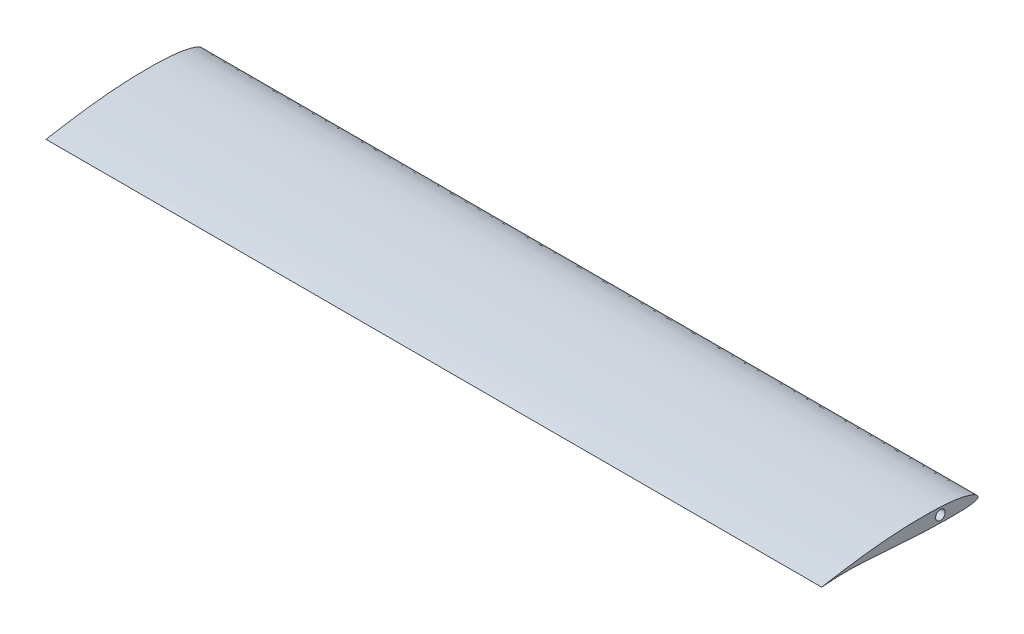
ISO-10303-21;
HEADER;
FILE_DESCRIPTION(('STEP AP214'),'2;1');
FILE_NAME('part.step','',(''),(''),'','','');
FILE_SCHEMA(('AUTOMOTIVE_DESIGN { 1 0 10303 214 1 1 1 1 }'));
ENDSEC;
DATA;
#1=APPLICATION_CONTEXT('core data for automotive mechanical design processes');
#2=APPLICATION_PROTOCOL_DEFINITION('international standard','automotive_design',2000,#1);
#3=PRODUCT_CONTEXT('',#1,'mechanical');
#4=PRODUCT('Part','Part','',(#3));
#5=PRODUCT_RELATED_PRODUCT_CATEGORY('part','',(#4));
#6=PRODUCT_DEFINITION_FORMATION('','',#4);
#7=PRODUCT_DEFINITION_CONTEXT('part definition',#1,'design');
#8=PRODUCT_DEFINITION('design','',#6,#7);
#9=PRODUCT_DEFINITION_SHAPE('','',#8);
#10=(LENGTH_UNIT() NAMED_UNIT(*) SI_UNIT(.MILLI.,.METRE.));
#11=(NAMED_UNIT(*) PLANE_ANGLE_UNIT() SI_UNIT($,.RADIAN.));
#12=(NAMED_UNIT(*) SI_UNIT($,.STERADIAN.) SOLID_ANGLE_UNIT());
#13=UNCERTAINTY_MEASURE_WITH_UNIT(LENGTH_MEASURE(1.E-05),#10,'distance_accuracy_value','');
#14=(GEOMETRIC_REPRESENTATION_CONTEXT(3) GLOBAL_UNCERTAINTY_ASSIGNED_CONTEXT((#13)) GLOBAL_UNIT_ASSIGNED_CONTEXT((#10,
#11,#12)) REPRESENTATION_CONTEXT('',''));
#15=CARTESIAN_POINT('',(0.,0.,0.));
#16=DIRECTION('',(0.,0.,1.));
#17=DIRECTION('',(1.,0.,0.));
#18=AXIS2_PLACEMENT_3D('',#15,#16,#17);
#19=CARTESIAN_POINT('',(1290.,0.,260.));
#20=CARTESIAN_POINT('',(1290.,-0.00836450781084765,260.000237425426));
#21=CARTESIAN_POINT('',(1290.,0.17927068428612,258.216353736153));
#22=CARTESIAN_POINT('',(1290.,0.321037615387213,256.378836916163));
#23=CARTESIAN_POINT('',(1290.,0.71312133760644,251.876962837134));
#24=CARTESIAN_POINT('',(1290.,1.11706559007267,246.278719714036));
#25=CARTESIAN_POINT('',(1290.,1.55720992954802,238.867601389705));
#26=CARTESIAN_POINT('',(1290.,1.89614734678387,230.031525046212));
#27=CARTESIAN_POINT('',(1290.,2.04633114470787,219.791122936035));
#28=CARTESIAN_POINT('',(1290.,1.90654989863903,208.386036068194));
#29=CARTESIAN_POINT('',(1290.,1.44518950143531,196.039910167381));
#30=CARTESIAN_POINT('',(1290.,0.734254641120929,182.99183491413));
#31=CARTESIAN_POINT('',(1290.,-0.166616987223974,169.448681914373));
#32=CARTESIAN_POINT('',(1290.,-1.19393698033351,155.600402613362));
#33=CARTESIAN_POINT('',(1290.,-2.27856190623283,141.623409194513));
#34=CARTESIAN_POINT('',(1290.,-3.34836733833728,127.677826169947));
#35=CARTESIAN_POINT('',(1290.,-4.31885285177987,113.900855730954));
#36=CARTESIAN_POINT('',(1290.,-5.13610693946993,100.407939813525));
#37=CARTESIAN_POINT('',(1290.,-5.75830393079422,87.2984520737085));
#38=CARTESIAN_POINT('',(1290.,-6.18555413279553,74.6739128622775));
#39=CARTESIAN_POINT('',(1290.,-6.46718897633444,62.6550662431943));
#40=CARTESIAN_POINT('',(1290.,-6.60958454607332,51.374682206385));
#41=CARTESIAN_POINT('',(1290.,-6.6366434813306,40.973115242036));
#42=CARTESIAN_POINT('',(1290.,-6.51565119953605,31.5764122356455));
#43=CARTESIAN_POINT('',(1290.,-6.25265151356062,23.308668347285));
#44=CARTESIAN_POINT('',(1290.,-5.82133125675498,16.2512763198776));
#45=CARTESIAN_POINT('',(1290.,-5.12585484253031,10.4747838113411));
#46=CARTESIAN_POINT('',(1290.,-4.20206486072263,5.92560031663002));
#47=CARTESIAN_POINT('',(1290.,-2.98038310378311,2.73033346429447));
#48=CARTESIAN_POINT('',(1290.,-1.77998960875286,0.514679594047473));
#49=CARTESIAN_POINT('',(1290.,-0.426872399851405,-0.0221650510671245));
#50=CARTESIAN_POINT('',(1290.,0.824366219771982,0.0324159675684111));
#51=CARTESIAN_POINT('',(1290.,2.39791171040937,0.845103211568665));
#52=CARTESIAN_POINT('',(1290.,4.40788652145266,2.8380180574038));
#53=CARTESIAN_POINT('',(1290.,6.36289900591226,6.00070353090517));
#54=CARTESIAN_POINT('',(1290.,8.23013796977206,10.2761805163656));
#55=CARTESIAN_POINT('',(1290.,10.0269709055182,15.6779276864178));
#56=CARTESIAN_POINT('',(1290.,11.735252347318,22.1507023104819));
#57=CARTESIAN_POINT('',(1290.,13.2999170289244,29.6370590050754));
#58=CARTESIAN_POINT('',(1290.,14.6617483044526,38.0716683424978));
#59=CARTESIAN_POINT('',(1290.,15.7658061778503,47.3959495779152));
#60=CARTESIAN_POINT('',(1290.,16.5993401578943,57.5462264774489));
#61=CARTESIAN_POINT('',(1290.,17.1538325279237,68.4491979583226));
#62=CARTESIAN_POINT('',(1290.,17.4636692933479,80.0086313108734));
#63=CARTESIAN_POINT('',(1290.,17.5393442961453,92.1096269892387));
#64=CARTESIAN_POINT('',(1290.,17.3957839030931,104.620879880964));
#65=CARTESIAN_POINT('',(1290.,17.0387204662747,117.404379021721));
#66=CARTESIAN_POINT('',(1290.,16.4585966132921,130.324080451916));
#67=CARTESIAN_POINT('',(1290.,15.6544251448711,143.253542740959));
#68=CARTESIAN_POINT('',(1290.,14.621712637195,156.075279757368));
#69=CARTESIAN_POINT('',(1290.,13.3968504654704,168.67903005791));
#70=CARTESIAN_POINT('',(1290.,12.0112515599174,180.948637295136));
#71=CARTESIAN_POINT('',(1290.,10.5208997181946,192.766459024276));
#72=CARTESIAN_POINT('',(1290.,8.97767429024449,204.009604965614));
#73=CARTESIAN_POINT('',(1290.,7.41677443920436,214.552459058349));
#74=CARTESIAN_POINT('',(1290.,5.96047063877256,224.182764610495));
#75=CARTESIAN_POINT('',(1290.,4.46502693224894,232.936243324283));
#76=CARTESIAN_POINT('',(1290.,3.30908122867847,240.617949869852));
#77=CARTESIAN_POINT('',(1290.,2.18290011399085,247.256298540505));
#78=CARTESIAN_POINT('',(1290.,1.29569639332671,252.326952140495));
#79=CARTESIAN_POINT('',(1290.,0.57497954408,256.510310505769));
#80=CARTESIAN_POINT('',(1290.,0.256065435225637,258.261534377982));
#81=CARTESIAN_POINT('',(1290.,0.00829647233421661,259.999764505752));
#82=CARTESIAN_POINT('',(1290.,0.,260.));
#83=B_SPLINE_CURVE_WITH_KNOTS('',3,(#19,#20,#21,#22,#23,#24,#25,#26,#27,#28,#29,#30,#31,#32,#33,
#34,#35,#36,#37,#38,#39,#40,#41,#42,#43,#44,#45,#46,#47,#48,#49,#50,#51,#52,#53,#54,#55,#56,#57,
#58,#59,#60,#61,#62,#63,#64,#65,#66,#67,#68,#69,#70,#71,#72,#73,#74,#75,#76,#77,#78,#79,#80,#81,
#82),.UNSPECIFIED.,.T.,.F.,(4,1,1,1,1,1,1,1,1,1,1,1,1,1,1,1,1,1,1,1,1,1,1,1,1,1,1,1,1,1,1,1,1,1,
1,1,1,1,1,1,1,1,1,1,1,1,1,1,1,1,1,1,1,1,1,1,1,1,1,1,1,4),(0.,0.00158888881614505,
0.00632921783555651,0.0142024564897437,0.0251728077530559,0.0391734833267745,0.0560606311759251,
0.0755789238487885,0.0973636066296907,0.120926258366677,0.145825281006277,0.171670911815127,
0.198108536705041,0.22479018357162,0.25139057978404,0.277643490654312,0.303326750051389,
0.328257458029316,0.352272548115194,0.375156061746876,0.396620664402003,0.416422729294005,
0.434304420097656,0.450054679859309,0.463465465082325,0.474478994238096,0.483169222153172,
0.489678354497499,0.494104066315723,0.496910015324886,0.497289784891853,0.501214273282497,
0.506457950332762,0.51335695674223,0.522168631834455,0.53296596992453,0.545689209241574,
0.56022077890382,0.57643892310517,0.594258689005965,0.613600244568652,0.634342385932902,
0.656331109263005,0.679351893859712,0.703152302846811,0.727478208080039,0.752070739407901,
0.776691163534608,0.801140183976245,0.825214386971546,0.848697423570622,0.871352857669295,
0.892947448931157,0.913230871058069,0.931955467148994,0.94834206907442,0.963693004275676,
0.976235918239566,0.986320058750392,0.993788799349345,0.998424034933867,1.),.UNSPECIFIED.);
#84=DIRECTION('',(-1.,0.,0.));
#85=VECTOR('',#84,1.);
#86=SURFACE_OF_LINEAR_EXTRUSION('',#83,#85);
#87=CARTESIAN_POINT('',(1290.,0.,260.));
#88=VERTEX_POINT('',#87);
#89=EDGE_CURVE('E10',#88,#88,#83,.T.);
#90=ORIENTED_EDGE('',*,*,#89,.F.);
#91=EDGE_LOOP('',(#90));
#92=FACE_BOUND('',#91,.T.);
#93=CARTESIAN_POINT('',(0.,0.,260.));
#94=CARTESIAN_POINT('',(0.,-0.00836450781084765,260.000237425426));
#95=CARTESIAN_POINT('',(0.,0.17927068428612,258.216353736153));
#96=CARTESIAN_POINT('',(0.,0.321037615387213,256.378836916163));
#97=CARTESIAN_POINT('',(0.,0.71312133760644,251.876962837134));
#98=CARTESIAN_POINT('',(0.,1.11706559007267,246.278719714036));
#99=CARTESIAN_POINT('',(0.,1.55720992954802,238.867601389705));
#100=CARTESIAN_POINT('',(0.,1.89614734678387,230.031525046212));
#101=CARTESIAN_POINT('',(0.,2.04633114470787,219.791122936035));
#102=CARTESIAN_POINT('',(0.,1.90654989863903,208.386036068194));
#103=CARTESIAN_POINT('',(0.,1.44518950143531,196.039910167381));
#104=CARTESIAN_POINT('',(0.,0.734254641120929,182.99183491413));
#105=CARTESIAN_POINT('',(0.,-0.166616987223974,169.448681914373));
#106=CARTESIAN_POINT('',(0.,-1.19393698033351,155.600402613362));
#107=CARTESIAN_POINT('',(0.,-2.27856190623283,141.623409194513));
#108=CARTESIAN_POINT('',(0.,-3.34836733833728,127.677826169947));
#109=CARTESIAN_POINT('',(0.,-4.31885285177987,113.900855730954));
#110=CARTESIAN_POINT('',(0.,-5.13610693946993,100.407939813525));
#111=CARTESIAN_POINT('',(0.,-5.75830393079422,87.2984520737085));
#112=CARTESIAN_POINT('',(0.,-6.18555413279553,74.6739128622775));
#113=CARTESIAN_POINT('',(0.,-6.46718897633444,62.6550662431943));
#114=CARTESIAN_POINT('',(0.,-6.60958454607332,51.374682206385));
#115=CARTESIAN_POINT('',(0.,-6.6366434813306,40.973115242036));
#116=CARTESIAN_POINT('',(0.,-6.51565119953605,31.5764122356455));
#117=CARTESIAN_POINT('',(0.,-6.25265151356062,23.308668347285));
#118=CARTESIAN_POINT('',(0.,-5.82133125675498,16.2512763198776));
#119=CARTESIAN_POINT('',(0.,-5.12585484253031,10.4747838113411));
#120=CARTESIAN_POINT('',(0.,-4.20206486072263,5.92560031663002));
#121=CARTESIAN_POINT('',(0.,-2.98038310378311,2.73033346429447));
#122=CARTESIAN_POINT('',(0.,-1.77998960875286,0.514679594047473));
#123=CARTESIAN_POINT('',(0.,-0.426872399851405,-0.0221650510671245));
#124=CARTESIAN_POINT('',(0.,0.824366219771982,0.0324159675684111));
#125=CARTESIAN_POINT('',(0.,2.39791171040937,0.845103211568665));
#126=CARTESIAN_POINT('',(0.,4.40788652145266,2.8380180574038));
#127=CARTESIAN_POINT('',(0.,6.36289900591226,6.00070353090517));
#128=CARTESIAN_POINT('',(0.,8.23013796977206,10.2761805163656));
#129=CARTESIAN_POINT('',(0.,10.0269709055182,15.6779276864178));
#130=CARTESIAN_POINT('',(0.,11.735252347318,22.1507023104819));
#131=CARTESIAN_POINT('',(0.,13.2999170289244,29.6370590050754));
#132=CARTESIAN_POINT('',(0.,14.6617483044526,38.0716683424978));
#133=CARTESIAN_POINT('',(0.,15.7658061778503,47.3959495779152));
#134=CARTESIAN_POINT('',(0.,16.5993401578943,57.5462264774489));
#135=CARTESIAN_POINT('',(0.,17.1538325279237,68.4491979583226));
#136=CARTESIAN_POINT('',(0.,17.4636692933479,80.0086313108734));
#137=CARTESIAN_POINT('',(0.,17.5393442961453,92.1096269892387));
#138=CARTESIAN_POINT('',(0.,17.3957839030931,104.620879880964));
#139=CARTESIAN_POINT('',(0.,17.0387204662747,117.404379021721));
#140=CARTESIAN_POINT('',(0.,16.4585966132921,130.324080451916));
#141=CARTESIAN_POINT('',(0.,15.6544251448711,143.253542740959));
#142=CARTESIAN_POINT('',(0.,14.621712637195,156.075279757368));
#143=CARTESIAN_POINT('',(0.,13.3968504654704,168.67903005791));
#144=CARTESIAN_POINT('',(0.,12.0112515599174,180.948637295136));
#145=CARTESIAN_POINT('',(0.,10.5208997181946,192.766459024276));
#146=CARTESIAN_POINT('',(0.,8.97767429024449,204.009604965614));
#147=CARTESIAN_POINT('',(0.,7.41677443920436,214.552459058349));
#148=CARTESIAN_POINT('',(0.,5.96047063877256,224.182764610495));
#149=CARTESIAN_POINT('',(0.,4.46502693224894,232.936243324283));
#150=CARTESIAN_POINT('',(0.,3.30908122867847,240.617949869852));
#151=CARTESIAN_POINT('',(0.,2.18290011399085,247.256298540505));
#152=CARTESIAN_POINT('',(0.,1.29569639332671,252.326952140495));
#153=CARTESIAN_POINT('',(0.,0.57497954408,256.510310505769));
#154=CARTESIAN_POINT('',(0.,0.256065435225637,258.261534377982));
#155=CARTESIAN_POINT('',(0.,0.00829647233421661,259.999764505752));
#156=CARTESIAN_POINT('',(0.,0.,260.));
#157=B_SPLINE_CURVE_WITH_KNOTS('',3,(#93,#94,#95,#96,#97,#98,#99,#100,#101,#102,#103,#104,#105,
#106,#107,#108,#109,#110,#111,#112,#113,#114,#115,#116,#117,#118,#119,#120,#121,#122,#123,#124,
#125,#126,#127,#128,#129,#130,#131,#132,#133,#134,#135,#136,#137,#138,#139,#140,#141,#142,#143,
#144,#145,#146,#147,#148,#149,#150,#151,#152,#153,#154,#155,#156),.UNSPECIFIED.,.T.,.F.,(4,1,1,
1,1,1,1,1,1,1,1,1,1,1,1,1,1,1,1,1,1,1,1,1,1,1,1,1,1,1,1,1,1,1,1,1,1,1,1,1,1,1,1,1,1,1,1,1,1,1,1,
1,1,1,1,1,1,1,1,1,1,4),(0.,0.00158888881614505,0.00632921783555651,0.0142024564897437,
0.0251728077530559,0.0391734833267745,0.0560606311759251,0.0755789238487885,0.0973636066296907,
0.120926258366677,0.145825281006277,0.171670911815127,0.198108536705041,0.22479018357162,
0.25139057978404,0.277643490654312,0.303326750051389,0.328257458029316,0.352272548115194,
0.375156061746876,0.396620664402003,0.416422729294005,0.434304420097656,0.450054679859309,
0.463465465082325,0.474478994238096,0.483169222153172,0.489678354497499,0.494104066315723,
0.496910015324886,0.497289784891853,0.501214273282497,0.506457950332762,0.51335695674223,
0.522168631834455,0.53296596992453,0.545689209241574,0.56022077890382,0.57643892310517,
0.594258689005965,0.613600244568652,0.634342385932902,0.656331109263005,0.679351893859712,
0.703152302846811,0.727478208080039,0.752070739407901,0.776691163534608,0.801140183976245,
0.825214386971546,0.848697423570622,0.871352857669295,0.892947448931157,0.913230871058069,
0.931955467148994,0.94834206907442,0.963693004275676,0.976235918239566,0.986320058750392,
0.993788799349345,0.998424034933867,1.),.UNSPECIFIED.);
#158=CARTESIAN_POINT('',(0.,0.,260.));
#159=VERTEX_POINT('',#158);
#160=EDGE_CURVE('E41',#159,#159,#157,.T.);
#161=ORIENTED_EDGE('',*,*,#160,.T.);
#162=EDGE_LOOP('',(#161));
#163=FACE_BOUND('',#162,.T.);
#164=ADVANCED_FACE('F37',(#92,#163),#86,.F.);
#165=CARTESIAN_POINT('',(1290.,1.55699578084547,0.452495766740479));
#166=DIRECTION('',(-1.,0.,0.));
#167=DIRECTION('',(0.,0.,1.));
#168=AXIS2_PLACEMENT_3D('',#165,#166,#167);
#169=PLANE('',#168);
#170=CARTESIAN_POINT('',(1290.,5.19465477293851,62.4999999999997));
#171=DIRECTION('',(1.,0.,0.));
#172=DIRECTION('',(0.,0.,-1.));
#173=AXIS2_PLACEMENT_3D('',#170,#171,#172);
#174=CIRCLE('',#173,8.);
#175=CARTESIAN_POINT('',(1290.,5.19465477293851,54.4999999999997));
#176=VERTEX_POINT('',#175);
#177=EDGE_CURVE('E56',#176,#176,#174,.T.);
#178=ORIENTED_EDGE('',*,*,#177,.F.);
#179=EDGE_LOOP('',(#178));
#180=FACE_BOUND('',#179,.T.);
#181=ORIENTED_EDGE('',*,*,#89,.T.);
#182=EDGE_LOOP('',(#181));
#183=FACE_BOUND('',#182,.T.);
#184=ADVANCED_FACE('F76',(#180,#183),#169,.F.);
#185=CARTESIAN_POINT('',(0.,1.55699578084547,0.452495766740479));
#186=DIRECTION('',(-1.,0.,0.));
#187=DIRECTION('',(0.,0.,1.));
#188=AXIS2_PLACEMENT_3D('',#185,#186,#187);
#189=PLANE('',#188);
#190=CARTESIAN_POINT('',(0.,5.19465477293851,62.4999999999997));
#191=DIRECTION('',(1.,0.,0.));
#192=DIRECTION('',(0.,0.,-1.));
#193=AXIS2_PLACEMENT_3D('',#190,#191,#192);
#194=CIRCLE('',#193,8.);
#195=CARTESIAN_POINT('',(0.,5.19465477293851,54.4999999999997));
#196=VERTEX_POINT('',#195);
#197=EDGE_CURVE('E51',#196,#196,#194,.T.);
#198=ORIENTED_EDGE('',*,*,#197,.T.);
#199=EDGE_LOOP('',(#198));
#200=FACE_BOUND('',#199,.T.);
#201=ORIENTED_EDGE('',*,*,#160,.F.);
#202=EDGE_LOOP('',(#201));
#203=FACE_BOUND('',#202,.T.);
#204=ADVANCED_FACE('F67',(#200,#203),#189,.T.);
#205=CARTESIAN_POINT('',(0.,5.19465477293851,62.4999999999997));
#206=DIRECTION('',(1.,0.,0.));
#207=DIRECTION('',(0.,0.,-1.));
#208=AXIS2_PLACEMENT_3D('',#205,#206,#207);
#209=CYLINDRICAL_SURFACE('',#208,8.);
#210=CARTESIAN_POINT('',(0.,5.19465477293851,54.4999999999997));
#211=CARTESIAN_POINT('',(13.4375,5.19465477293851,54.4999999999997));
#212=CARTESIAN_POINT('',(26.875,5.19465477293851,54.4999999999997));
#213=CARTESIAN_POINT('',(53.75,5.19465477293851,54.4999999999997));
#214=CARTESIAN_POINT('',(67.1875,5.19465477293851,54.4999999999997));
#215=CARTESIAN_POINT('',(94.0625,5.19465477293851,54.4999999999997));
#216=CARTESIAN_POINT('',(107.5,5.19465477293851,54.4999999999997));
#217=CARTESIAN_POINT('',(134.375,5.19465477293851,54.4999999999997));
#218=CARTESIAN_POINT('',(147.8125,5.19465477293851,54.4999999999997));
#219=CARTESIAN_POINT('',(174.6875,5.19465477293851,54.4999999999997));
#220=CARTESIAN_POINT('',(188.125,5.19465477293851,54.4999999999997));
#221=CARTESIAN_POINT('',(215.,5.19465477293851,54.4999999999997));
#222=CARTESIAN_POINT('',(228.4375,5.19465477293851,54.4999999999997));
#223=CARTESIAN_POINT('',(255.3125,5.19465477293851,54.4999999999997));
#224=CARTESIAN_POINT('',(268.75,5.19465477293851,54.4999999999997));
#225=CARTESIAN_POINT('',(295.625,5.19465477293851,54.4999999999997));
#226=CARTESIAN_POINT('',(309.0625,5.19465477293851,54.4999999999997));
#227=CARTESIAN_POINT('',(335.9375,5.19465477293851,54.4999999999997));
#228=CARTESIAN_POINT('',(349.375,5.19465477293851,54.4999999999997));
#229=CARTESIAN_POINT('',(376.25,5.19465477293851,54.4999999999997));
#230=CARTESIAN_POINT('',(389.6875,5.19465477293851,54.4999999999997));
#231=CARTESIAN_POINT('',(416.5625,5.19465477293851,54.4999999999997));
#232=CARTESIAN_POINT('',(430.,5.19465477293851,54.4999999999997));
#233=CARTESIAN_POINT('',(456.875,5.19465477293851,54.4999999999997));
#234=CARTESIAN_POINT('',(470.3125,5.19465477293851,54.4999999999997));
#235=CARTESIAN_POINT('',(497.1875,5.19465477293851,54.4999999999997));
#236=CARTESIAN_POINT('',(510.625,5.19465477293851,54.4999999999997));
#237=CARTESIAN_POINT('',(537.5,5.19465477293851,54.4999999999997));
#238=CARTESIAN_POINT('',(550.9375,5.19465477293851,54.4999999999997));
#239=CARTESIAN_POINT('',(577.8125,5.19465477293851,54.4999999999997));
#240=CARTESIAN_POINT('',(591.25,5.19465477293851,54.4999999999997));
#241=CARTESIAN_POINT('',(618.125,5.19465477293851,54.4999999999997));
#242=CARTESIAN_POINT('',(631.5625,5.19465477293851,54.4999999999997));
#243=CARTESIAN_POINT('',(658.4375,5.19465477293851,54.4999999999997));
#244=CARTESIAN_POINT('',(671.875,5.19465477293851,54.4999999999997));
#245=CARTESIAN_POINT('',(698.75,5.19465477293851,54.4999999999997));
#246=CARTESIAN_POINT('',(712.1875,5.19465477293851,54.4999999999997));
#247=CARTESIAN_POINT('',(739.0625,5.19465477293851,54.4999999999997));
#248=CARTESIAN_POINT('',(752.5,5.19465477293851,54.4999999999997));
#249=CARTESIAN_POINT('',(779.375,5.19465477293851,54.4999999999997));
#250=CARTESIAN_POINT('',(792.8125,5.19465477293851,54.4999999999997));
#251=CARTESIAN_POINT('',(819.6875,5.19465477293851,54.4999999999997));
#252=CARTESIAN_POINT('',(833.125,5.19465477293851,54.4999999999997));
#253=CARTESIAN_POINT('',(860.,5.19465477293851,54.4999999999997));
#254=CARTESIAN_POINT('',(873.4375,5.19465477293851,54.4999999999997));
#255=CARTESIAN_POINT('',(900.3125,5.19465477293851,54.4999999999997));
#256=CARTESIAN_POINT('',(913.75,5.19465477293851,54.4999999999997));
#257=CARTESIAN_POINT('',(940.625,5.19465477293851,54.4999999999997));
#258=CARTESIAN_POINT('',(954.0625,5.19465477293851,54.4999999999997));
#259=CARTESIAN_POINT('',(980.9375,5.19465477293851,54.4999999999997));
#260=CARTESIAN_POINT('',(994.375,5.19465477293851,54.4999999999997));
#261=CARTESIAN_POINT('',(1021.25,5.19465477293851,54.4999999999997));
#262=CARTESIAN_POINT('',(1034.6875,5.19465477293851,54.4999999999997));
#263=CARTESIAN_POINT('',(1061.5625,5.19465477293851,54.4999999999997));
#264=CARTESIAN_POINT('',(1075.,5.19465477293851,54.4999999999997));
#265=CARTESIAN_POINT('',(1101.875,5.19465477293851,54.4999999999997));
#266=CARTESIAN_POINT('',(1115.3125,5.19465477293851,54.4999999999997));
#267=CARTESIAN_POINT('',(1142.1875,5.19465477293851,54.4999999999997));
#268=CARTESIAN_POINT('',(1155.625,5.19465477293851,54.4999999999997));
#269=CARTESIAN_POINT('',(1182.5,5.19465477293851,54.4999999999997));
#270=CARTESIAN_POINT('',(1195.9375,5.19465477293851,54.4999999999997));
#271=CARTESIAN_POINT('',(1222.8125,5.19465477293851,54.4999999999997));
#272=CARTESIAN_POINT('',(1236.25,5.19465477293851,54.4999999999997));
#273=CARTESIAN_POINT('',(1263.125,5.19465477293851,54.4999999999997));
#274=CARTESIAN_POINT('',(1276.5625,5.19465477293851,54.4999999999997));
#275=CARTESIAN_POINT('',(1290.,5.19465477293851,54.4999999999997));
#276=B_SPLINE_CURVE_WITH_KNOTS('',3,(#210,#211,#212,#213,#214,#215,#216,#217,#218,#219,#220,
#221,#222,#223,#224,#225,#226,#227,#228,#229,#230,#231,#232,#233,#234,#235,#236,#237,#238,#239,
#240,#241,#242,#243,#244,#245,#246,#247,#248,#249,#250,#251,#252,#253,#254,#255,#256,#257,#258,
#259,#260,#261,#262,#263,#264,#265,#266,#267,#268,#269,#270,#271,#272,#273,#274,#275),
.UNSPECIFIED.,.F.,.F.,(4,2,2,2,2,2,2,2,2,2,2,2,2,2,2,2,2,2,2,2,2,2,2,2,2,2,2,2,2,2,2,2,4),(0.,
40.3125,80.625,120.9375,161.25,201.5625,241.875,282.1875,322.5,362.8125,403.125,443.4375,483.75,
524.0625,564.375,604.6875,645.,685.3125,725.625,765.9375,806.25,846.5625,886.875,927.1875,967.5,
1007.8125,1048.125,1088.4375,1128.75,1169.0625,1209.375,1249.6875,1290.),.UNSPECIFIED.);
#277=EDGE_CURVE('BSEAM70',#196,#176,#276,.T.);
#278=ORIENTED_EDGE('',*,*,#197,.F.);
#279=ORIENTED_EDGE('',*,*,#177,.T.);
#280=ORIENTED_EDGE('',*,*,#277,.T.);
#281=ORIENTED_EDGE('',*,*,#277,.F.);
#282=EDGE_LOOP('',(#278,#280,#279,#281));
#283=FACE_BOUND('',#282,.T.);
#284=ADVANCED_FACE('F70',(#283),#209,.F.);
#285=CLOSED_SHELL('',(#164,#184,#204,#284));
#286=MANIFOLD_SOLID_BREP('B2',#285);
#287=ADVANCED_BREP_SHAPE_REPRESENTATION('',(#18,#286),#14);
#288=SHAPE_DEFINITION_REPRESENTATION(#9,#287);
ENDSEC;
END-ISO-10303-21;
